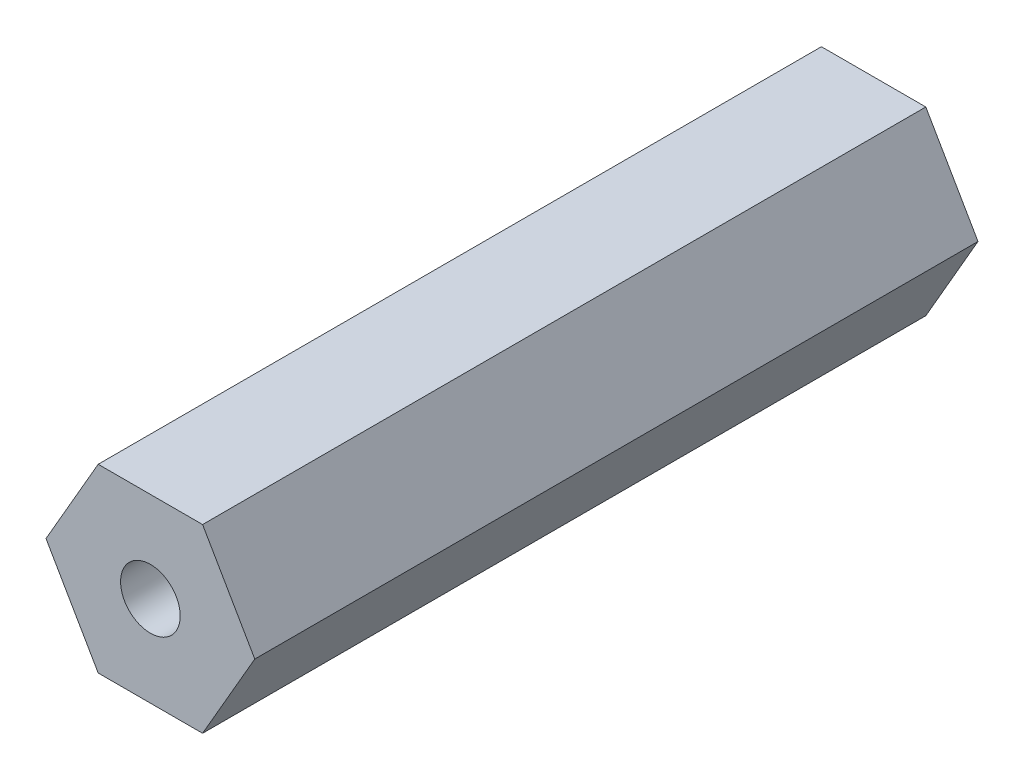
ISO-10303-21;
HEADER;
FILE_DESCRIPTION(('STEP AP214'),'2;1');
FILE_NAME('part.step','',(''),(''),'','','');
FILE_SCHEMA(('AUTOMOTIVE_DESIGN { 1 0 10303 214 1 1 1 1 }'));
ENDSEC;
DATA;
#1=APPLICATION_CONTEXT('core data for automotive mechanical design processes');
#2=APPLICATION_PROTOCOL_DEFINITION('international standard','automotive_design',2000,#1);
#3=PRODUCT_CONTEXT('',#1,'mechanical');
#4=PRODUCT('Part','Part','',(#3));
#5=PRODUCT_RELATED_PRODUCT_CATEGORY('part','',(#4));
#6=PRODUCT_DEFINITION_FORMATION('','',#4);
#7=PRODUCT_DEFINITION_CONTEXT('part definition',#1,'design');
#8=PRODUCT_DEFINITION('design','',#6,#7);
#9=PRODUCT_DEFINITION_SHAPE('','',#8);
#10=(LENGTH_UNIT() NAMED_UNIT(*) SI_UNIT(.MILLI.,.METRE.));
#11=(NAMED_UNIT(*) PLANE_ANGLE_UNIT() SI_UNIT($,.RADIAN.));
#12=(NAMED_UNIT(*) SI_UNIT($,.STERADIAN.) SOLID_ANGLE_UNIT());
#13=UNCERTAINTY_MEASURE_WITH_UNIT(LENGTH_MEASURE(1.E-05),#10,'distance_accuracy_value','');
#14=(GEOMETRIC_REPRESENTATION_CONTEXT(3) GLOBAL_UNCERTAINTY_ASSIGNED_CONTEXT((#13)) GLOBAL_UNIT_ASSIGNED_CONTEXT((#10,
#11,#12)) REPRESENTATION_CONTEXT('',''));
#15=CARTESIAN_POINT('',(0.,0.,0.));
#16=DIRECTION('',(0.,0.,1.));
#17=DIRECTION('',(1.,0.,0.));
#18=AXIS2_PLACEMENT_3D('',#15,#16,#17);
#19=CARTESIAN_POINT('',(2.88675134594813,-5.,40.));
#20=DIRECTION('',(-0.866025403784439,0.5,0.));
#21=DIRECTION('',(-0.5,-0.866025403784439,0.));
#22=AXIS2_PLACEMENT_3D('',#19,#20,#21);
#23=PLANE('',#22);
#24=DIRECTION('',(0.5,0.866025403784439,0.));
#25=VECTOR('',#24,1.);
#26=CARTESIAN_POINT('',(2.88675134594813,-5.,0.));
#27=LINE('',#26,#25);
#28=CARTESIAN_POINT('',(2.88675134594813,-5.,0.));
#29=VERTEX_POINT('',#28);
#30=CARTESIAN_POINT('',(5.77350269189626,0.,0.));
#31=VERTEX_POINT('',#30);
#32=EDGE_CURVE('E117',#29,#31,#27,.T.);
#33=ORIENTED_EDGE('',*,*,#32,.T.);
#34=DIRECTION('',(0.,0.,-1.));
#35=VECTOR('',#34,1.);
#36=CARTESIAN_POINT('',(5.77350269189626,0.,40.));
#37=LINE('',#36,#35);
#38=CARTESIAN_POINT('',(5.77350269189626,0.,40.));
#39=VERTEX_POINT('',#38);
#40=EDGE_CURVE('E11',#39,#31,#37,.T.);
#41=ORIENTED_EDGE('',*,*,#40,.F.);
#42=DIRECTION('',(0.5,0.866025403784439,0.));
#43=VECTOR('',#42,1.);
#44=CARTESIAN_POINT('',(2.88675134594813,-5.,40.));
#45=LINE('',#44,#43);
#46=CARTESIAN_POINT('',(2.88675134594813,-5.,40.));
#47=VERTEX_POINT('',#46);
#48=EDGE_CURVE('E128',#47,#39,#45,.T.);
#49=ORIENTED_EDGE('',*,*,#48,.F.);
#50=DIRECTION('',(0.,0.,-1.));
#51=VECTOR('',#50,1.);
#52=CARTESIAN_POINT('',(2.88675134594813,-5.,40.));
#53=LINE('',#52,#51);
#54=EDGE_CURVE('E113',#47,#29,#53,.T.);
#55=ORIENTED_EDGE('',*,*,#54,.T.);
#56=EDGE_LOOP('',(#33,#41,#49,#55));
#57=FACE_BOUND('',#56,.T.);
#58=ADVANCED_FACE('F33',(#57),#23,.F.);
#59=CARTESIAN_POINT('',(5.77350269189626,0.,40.));
#60=DIRECTION('',(-0.866025403784438,-0.5,0.));
#61=DIRECTION('',(0.5,-0.866025403784438,0.));
#62=AXIS2_PLACEMENT_3D('',#59,#60,#61);
#63=PLANE('',#62);
#64=DIRECTION('',(-0.5,0.866025403784438,0.));
#65=VECTOR('',#64,1.);
#66=CARTESIAN_POINT('',(5.77350269189626,0.,0.));
#67=LINE('',#66,#65);
#68=CARTESIAN_POINT('',(2.88675134594813,5.,0.));
#69=VERTEX_POINT('',#68);
#70=EDGE_CURVE('E120',#31,#69,#67,.T.);
#71=ORIENTED_EDGE('',*,*,#70,.T.);
#72=DIRECTION('',(0.,0.,-1.));
#73=VECTOR('',#72,1.);
#74=CARTESIAN_POINT('',(2.88675134594813,5.,40.));
#75=LINE('',#74,#73);
#76=CARTESIAN_POINT('',(2.88675134594813,5.,40.));
#77=VERTEX_POINT('',#76);
#78=EDGE_CURVE('E41',#77,#69,#75,.T.);
#79=ORIENTED_EDGE('',*,*,#78,.F.);
#80=DIRECTION('',(-0.5,0.866025403784438,0.));
#81=VECTOR('',#80,1.);
#82=CARTESIAN_POINT('',(5.77350269189626,0.,40.));
#83=LINE('',#82,#81);
#84=EDGE_CURVE('E86',#39,#77,#83,.T.);
#85=ORIENTED_EDGE('',*,*,#84,.F.);
#86=ORIENTED_EDGE('',*,*,#40,.T.);
#87=EDGE_LOOP('',(#71,#79,#85,#86));
#88=FACE_BOUND('',#87,.T.);
#89=ADVANCED_FACE('F153',(#88),#63,.F.);
#90=CARTESIAN_POINT('',(2.88675134594813,5.,40.));
#91=DIRECTION('',(0.,-1.,0.));
#92=DIRECTION('',(1.,0.,0.));
#93=AXIS2_PLACEMENT_3D('',#90,#91,#92);
#94=PLANE('',#93);
#95=DIRECTION('',(-1.,0.,0.));
#96=VECTOR('',#95,1.);
#97=CARTESIAN_POINT('',(2.88675134594813,5.,0.));
#98=LINE('',#97,#96);
#99=CARTESIAN_POINT('',(-2.88675134594813,5.,0.));
#100=VERTEX_POINT('',#99);
#101=EDGE_CURVE('E123',#69,#100,#98,.T.);
#102=ORIENTED_EDGE('',*,*,#101,.T.);
#103=DIRECTION('',(0.,0.,-1.));
#104=VECTOR('',#103,1.);
#105=CARTESIAN_POINT('',(-2.88675134594813,5.,40.));
#106=LINE('',#105,#104);
#107=CARTESIAN_POINT('',(-2.88675134594813,5.,40.));
#108=VERTEX_POINT('',#107);
#109=EDGE_CURVE('E108',#108,#100,#106,.T.);
#110=ORIENTED_EDGE('',*,*,#109,.F.);
#111=DIRECTION('',(-1.,0.,0.));
#112=VECTOR('',#111,1.);
#113=CARTESIAN_POINT('',(2.88675134594813,5.,40.));
#114=LINE('',#113,#112);
#115=EDGE_CURVE('E99',#77,#108,#114,.T.);
#116=ORIENTED_EDGE('',*,*,#115,.F.);
#117=ORIENTED_EDGE('',*,*,#78,.T.);
#118=EDGE_LOOP('',(#102,#110,#116,#117));
#119=FACE_BOUND('',#118,.T.);
#120=ADVANCED_FACE('F134',(#119),#94,.F.);
#121=CARTESIAN_POINT('',(-2.88675134594813,5.,40.));
#122=DIRECTION('',(0.866025403784439,-0.5,0.));
#123=DIRECTION('',(0.5,0.866025403784439,0.));
#124=AXIS2_PLACEMENT_3D('',#121,#122,#123);
#125=PLANE('',#124);
#126=DIRECTION('',(-0.5,-0.866025403784439,0.));
#127=VECTOR('',#126,1.);
#128=CARTESIAN_POINT('',(-2.88675134594813,5.,0.));
#129=LINE('',#128,#127);
#130=CARTESIAN_POINT('',(-5.77350269189626,0.,0.));
#131=VERTEX_POINT('',#130);
#132=EDGE_CURVE('E107',#100,#131,#129,.T.);
#133=ORIENTED_EDGE('',*,*,#132,.T.);
#134=DIRECTION('',(0.,0.,-1.));
#135=VECTOR('',#134,1.);
#136=CARTESIAN_POINT('',(-5.77350269189626,0.,40.));
#137=LINE('',#136,#135);
#138=CARTESIAN_POINT('',(-5.77350269189626,0.,40.));
#139=VERTEX_POINT('',#138);
#140=EDGE_CURVE('E104',#139,#131,#137,.T.);
#141=ORIENTED_EDGE('',*,*,#140,.F.);
#142=DIRECTION('',(-0.5,-0.866025403784439,0.));
#143=VECTOR('',#142,1.);
#144=CARTESIAN_POINT('',(-2.88675134594813,5.,40.));
#145=LINE('',#144,#143);
#146=EDGE_CURVE('E93',#108,#139,#145,.T.);
#147=ORIENTED_EDGE('',*,*,#146,.F.);
#148=ORIENTED_EDGE('',*,*,#109,.T.);
#149=EDGE_LOOP('',(#133,#141,#147,#148));
#150=FACE_BOUND('',#149,.T.);
#151=ADVANCED_FACE('F105',(#150),#125,.F.);
#152=CARTESIAN_POINT('',(-5.77350269189626,0.,40.));
#153=DIRECTION('',(0.866025403784439,0.5,0.));
#154=DIRECTION('',(-0.5,0.866025403784439,0.));
#155=AXIS2_PLACEMENT_3D('',#152,#153,#154);
#156=PLANE('',#155);
#157=DIRECTION('',(0.5,-0.866025403784439,0.));
#158=VECTOR('',#157,1.);
#159=CARTESIAN_POINT('',(-5.77350269189626,0.,0.));
#160=LINE('',#159,#158);
#161=CARTESIAN_POINT('',(-2.88675134594813,-5.,0.));
#162=VERTEX_POINT('',#161);
#163=EDGE_CURVE('E72',#131,#162,#160,.T.);
#164=ORIENTED_EDGE('',*,*,#163,.T.);
#165=DIRECTION('',(0.,0.,-1.));
#166=VECTOR('',#165,1.);
#167=CARTESIAN_POINT('',(-2.88675134594813,-5.,40.));
#168=LINE('',#167,#166);
#169=CARTESIAN_POINT('',(-2.88675134594813,-5.,40.));
#170=VERTEX_POINT('',#169);
#171=EDGE_CURVE('E109',#170,#162,#168,.T.);
#172=ORIENTED_EDGE('',*,*,#171,.F.);
#173=DIRECTION('',(0.5,-0.866025403784439,0.));
#174=VECTOR('',#173,1.);
#175=CARTESIAN_POINT('',(-5.77350269189626,0.,40.));
#176=LINE('',#175,#174);
#177=EDGE_CURVE('E97',#139,#170,#176,.T.);
#178=ORIENTED_EDGE('',*,*,#177,.F.);
#179=ORIENTED_EDGE('',*,*,#140,.T.);
#180=EDGE_LOOP('',(#164,#172,#178,#179));
#181=FACE_BOUND('',#180,.T.);
#182=ADVANCED_FACE('F111',(#181),#156,.F.);
#183=CARTESIAN_POINT('',(-2.88675134594813,-5.,40.));
#184=DIRECTION('',(0.,1.,0.));
#185=DIRECTION('',(0.,0.,1.));
#186=AXIS2_PLACEMENT_3D('',#183,#184,#185);
#187=PLANE('',#186);
#188=DIRECTION('',(1.,0.,0.));
#189=VECTOR('',#188,1.);
#190=CARTESIAN_POINT('',(-2.88675134594813,-5.,0.));
#191=LINE('',#190,#189);
#192=EDGE_CURVE('E78',#162,#29,#191,.T.);
#193=ORIENTED_EDGE('',*,*,#192,.T.);
#194=ORIENTED_EDGE('',*,*,#54,.F.);
#195=DIRECTION('',(1.,0.,0.));
#196=VECTOR('',#195,1.);
#197=CARTESIAN_POINT('',(-2.88675134594813,-5.,40.));
#198=LINE('',#197,#196);
#199=EDGE_CURVE('E49',#170,#47,#198,.T.);
#200=ORIENTED_EDGE('',*,*,#199,.F.);
#201=ORIENTED_EDGE('',*,*,#171,.T.);
#202=EDGE_LOOP('',(#193,#194,#200,#201));
#203=FACE_BOUND('',#202,.T.);
#204=ADVANCED_FACE('F141',(#203),#187,.F.);
#205=CARTESIAN_POINT('',(0.,0.,40.));
#206=DIRECTION('',(0.,0.,1.));
#207=DIRECTION('',(1.,0.,0.));
#208=AXIS2_PLACEMENT_3D('',#205,#206,#207);
#209=PLANE('',#208);
#210=CARTESIAN_POINT('',(0.,0.,40.));
#211=DIRECTION('',(0.,0.,1.));
#212=DIRECTION('',(1.,0.,0.));
#213=AXIS2_PLACEMENT_3D('',#210,#211,#212);
#214=CIRCLE('',#213,1.65);
#215=CARTESIAN_POINT('',(1.65,0.,40.));
#216=VERTEX_POINT('',#215);
#217=EDGE_CURVE('E236',#216,#216,#214,.T.);
#218=ORIENTED_EDGE('',*,*,#217,.F.);
#219=EDGE_LOOP('',(#218));
#220=FACE_BOUND('',#219,.T.);
#221=ORIENTED_EDGE('',*,*,#48,.T.);
#222=ORIENTED_EDGE('',*,*,#84,.T.);
#223=ORIENTED_EDGE('',*,*,#115,.T.);
#224=ORIENTED_EDGE('',*,*,#146,.T.);
#225=ORIENTED_EDGE('',*,*,#177,.T.);
#226=ORIENTED_EDGE('',*,*,#199,.T.);
#227=EDGE_LOOP('',(#221,#222,#223,#224,#225,#226));
#228=FACE_BOUND('',#227,.T.);
#229=ADVANCED_FACE('F95',(#220,#228),#209,.T.);
#230=CARTESIAN_POINT('',(0.,0.,0.));
#231=DIRECTION('',(0.,0.,1.));
#232=DIRECTION('',(1.,0.,0.));
#233=AXIS2_PLACEMENT_3D('',#230,#231,#232);
#234=PLANE('',#233);
#235=CARTESIAN_POINT('',(0.,0.,0.));
#236=DIRECTION('',(0.,0.,1.));
#237=DIRECTION('',(1.,0.,0.));
#238=AXIS2_PLACEMENT_3D('',#235,#236,#237);
#239=CIRCLE('',#238,1.65);
#240=CARTESIAN_POINT('',(1.65,0.,0.));
#241=VERTEX_POINT('',#240);
#242=EDGE_CURVE('E237',#241,#241,#239,.T.);
#243=ORIENTED_EDGE('',*,*,#242,.T.);
#244=EDGE_LOOP('',(#243));
#245=FACE_BOUND('',#244,.T.);
#246=ORIENTED_EDGE('',*,*,#32,.F.);
#247=ORIENTED_EDGE('',*,*,#192,.F.);
#248=ORIENTED_EDGE('',*,*,#163,.F.);
#249=ORIENTED_EDGE('',*,*,#132,.F.);
#250=ORIENTED_EDGE('',*,*,#101,.F.);
#251=ORIENTED_EDGE('',*,*,#70,.F.);
#252=EDGE_LOOP('',(#246,#247,#248,#249,#250,#251));
#253=FACE_BOUND('',#252,.T.);
#254=ADVANCED_FACE('F137',(#245,#253),#234,.F.);
#255=CARTESIAN_POINT('',(0.,0.,31.));
#256=DIRECTION('',(0.,0.,1.));
#257=DIRECTION('',(1.,0.,0.));
#258=AXIS2_PLACEMENT_3D('',#255,#256,#257);
#259=CYLINDRICAL_SURFACE('',#258,1.65);
#260=CARTESIAN_POINT('',(0.,0.,31.));
#261=DIRECTION('',(0.,0.,1.));
#262=DIRECTION('',(1.,0.,0.));
#263=AXIS2_PLACEMENT_3D('',#260,#261,#262);
#264=CIRCLE('',#263,1.65);
#265=CARTESIAN_POINT('',(1.65,0.,31.));
#266=VERTEX_POINT('',#265);
#267=EDGE_CURVE('E121',#266,#266,#264,.T.);
#268=ORIENTED_EDGE('',*,*,#267,.F.);
#269=EDGE_LOOP('',(#268));
#270=FACE_BOUND('',#269,.T.);
#271=ORIENTED_EDGE('',*,*,#217,.T.);
#272=EDGE_LOOP('',(#271));
#273=FACE_BOUND('',#272,.T.);
#274=ADVANCED_FACE('F188',(#270,#273),#259,.F.);
#275=CARTESIAN_POINT('',(0.,0.,31.));
#276=DIRECTION('',(0.,0.,1.));
#277=DIRECTION('',(1.,0.,0.));
#278=AXIS2_PLACEMENT_3D('',#275,#276,#277);
#279=PLANE('',#278);
#280=ORIENTED_EDGE('',*,*,#267,.T.);
#281=EDGE_LOOP('',(#280));
#282=FACE_BOUND('',#281,.T.);
#283=ADVANCED_FACE('F193',(#282),#279,.T.);
#284=CARTESIAN_POINT('',(0.,0.,9.));
#285=DIRECTION('',(0.,0.,-1.));
#286=DIRECTION('',(-1.,0.,0.));
#287=AXIS2_PLACEMENT_3D('',#284,#285,#286);
#288=CYLINDRICAL_SURFACE('',#287,1.65);
#289=CARTESIAN_POINT('',(0.,0.,9.));
#290=DIRECTION('',(0.,0.,1.));
#291=DIRECTION('',(1.,0.,0.));
#292=AXIS2_PLACEMENT_3D('',#289,#290,#291);
#293=CIRCLE('',#292,1.65);
#294=CARTESIAN_POINT('',(1.65,0.,9.));
#295=VERTEX_POINT('',#294);
#296=EDGE_CURVE('E235',#295,#295,#293,.T.);
#297=ORIENTED_EDGE('',*,*,#296,.T.);
#298=EDGE_LOOP('',(#297));
#299=FACE_BOUND('',#298,.T.);
#300=ORIENTED_EDGE('',*,*,#242,.F.);
#301=EDGE_LOOP('',(#300));
#302=FACE_BOUND('',#301,.T.);
#303=ADVANCED_FACE('F203',(#299,#302),#288,.F.);
#304=CARTESIAN_POINT('',(0.,0.,9.));
#305=DIRECTION('',(0.,0.,1.));
#306=DIRECTION('',(1.,0.,0.));
#307=AXIS2_PLACEMENT_3D('',#304,#305,#306);
#308=PLANE('',#307);
#309=ORIENTED_EDGE('',*,*,#296,.F.);
#310=EDGE_LOOP('',(#309));
#311=FACE_BOUND('',#310,.T.);
#312=ADVANCED_FACE('F219',(#311),#308,.F.);
#313=CLOSED_SHELL('',(#58,#89,#120,#151,#182,#204,#229,#254,#274,#283,#303,#312));
#314=MANIFOLD_SOLID_BREP('B2',#313);
#315=ADVANCED_BREP_SHAPE_REPRESENTATION('',(#18,#314),#14);
#316=SHAPE_DEFINITION_REPRESENTATION(#9,#315);
ENDSEC;
END-ISO-10303-21;
